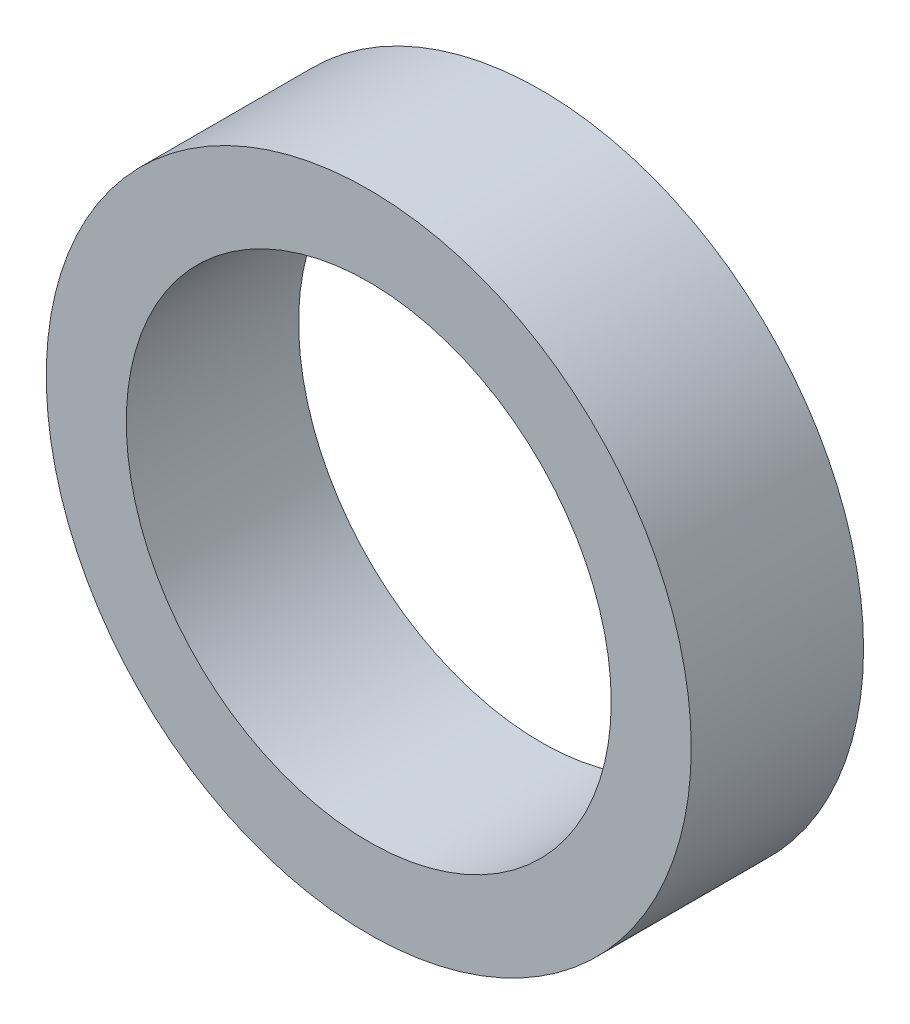
ISO-10303-21;
HEADER;
FILE_DESCRIPTION(('STEP AP214'),'2;1');
FILE_NAME('part.step','',(''),(''),'','','');
FILE_SCHEMA(('AUTOMOTIVE_DESIGN { 1 0 10303 214 1 1 1 1 }'));
ENDSEC;
DATA;
#1=APPLICATION_CONTEXT('core data for automotive mechanical design processes');
#2=APPLICATION_PROTOCOL_DEFINITION('international standard','automotive_design',2000,#1);
#3=PRODUCT_CONTEXT('',#1,'mechanical');
#4=PRODUCT('Part','Part','',(#3));
#5=PRODUCT_RELATED_PRODUCT_CATEGORY('part','',(#4));
#6=PRODUCT_DEFINITION_FORMATION('','',#4);
#7=PRODUCT_DEFINITION_CONTEXT('part definition',#1,'design');
#8=PRODUCT_DEFINITION('design','',#6,#7);
#9=PRODUCT_DEFINITION_SHAPE('','',#8);
#10=(LENGTH_UNIT() NAMED_UNIT(*) SI_UNIT(.MILLI.,.METRE.));
#11=(NAMED_UNIT(*) PLANE_ANGLE_UNIT() SI_UNIT($,.RADIAN.));
#12=(NAMED_UNIT(*) SI_UNIT($,.STERADIAN.) SOLID_ANGLE_UNIT());
#13=UNCERTAINTY_MEASURE_WITH_UNIT(LENGTH_MEASURE(1.E-05),#10,'distance_accuracy_value','');
#14=(GEOMETRIC_REPRESENTATION_CONTEXT(3) GLOBAL_UNCERTAINTY_ASSIGNED_CONTEXT((#13)) GLOBAL_UNIT_ASSIGNED_CONTEXT((#10,
#11,#12)) REPRESENTATION_CONTEXT('',''));
#15=CARTESIAN_POINT('',(0.,0.,0.));
#16=DIRECTION('',(0.,0.,1.));
#17=DIRECTION('',(1.,0.,0.));
#18=AXIS2_PLACEMENT_3D('',#15,#16,#17);
#19=CARTESIAN_POINT('',(0.,0.,35.));
#20=DIRECTION('',(0.,0.,1.));
#21=DIRECTION('',(1.,0.,0.));
#22=AXIS2_PLACEMENT_3D('',#19,#20,#21);
#23=PLANE('',#22);
#24=CARTESIAN_POINT('',(0.,0.,35.));
#25=DIRECTION('',(0.,0.,1.));
#26=DIRECTION('',(1.,0.,0.));
#27=AXIS2_PLACEMENT_3D('',#24,#25,#26);
#28=CIRCLE('',#27,65.5);
#29=CARTESIAN_POINT('',(65.5,0.,35.));
#30=VERTEX_POINT('',#29);
#31=EDGE_CURVE('E10',#30,#30,#28,.T.);
#32=ORIENTED_EDGE('',*,*,#31,.T.);
#33=EDGE_LOOP('',(#32));
#34=FACE_BOUND('',#33,.T.);
#35=CARTESIAN_POINT('',(0.,0.,35.));
#36=DIRECTION('',(0.,0.,1.));
#37=DIRECTION('',(1.,0.,0.));
#38=AXIS2_PLACEMENT_3D('',#35,#36,#37);
#39=CIRCLE('',#38,49.25);
#40=CARTESIAN_POINT('',(49.25,0.,35.));
#41=VERTEX_POINT('',#40);
#42=EDGE_CURVE('E56',#41,#41,#39,.T.);
#43=ORIENTED_EDGE('',*,*,#42,.F.);
#44=EDGE_LOOP('',(#43));
#45=FACE_BOUND('',#44,.T.);
#46=ADVANCED_FACE('F43',(#34,#45),#23,.T.);
#47=CARTESIAN_POINT('',(0.,0.,0.));
#48=DIRECTION('',(0.,0.,1.));
#49=DIRECTION('',(1.,0.,0.));
#50=AXIS2_PLACEMENT_3D('',#47,#48,#49);
#51=PLANE('',#50);
#52=CARTESIAN_POINT('',(0.,0.,0.));
#53=DIRECTION('',(0.,0.,1.));
#54=DIRECTION('',(1.,0.,0.));
#55=AXIS2_PLACEMENT_3D('',#52,#53,#54);
#56=CIRCLE('',#55,65.5);
#57=CARTESIAN_POINT('',(65.5,0.,0.));
#58=VERTEX_POINT('',#57);
#59=EDGE_CURVE('E47',#58,#58,#56,.T.);
#60=ORIENTED_EDGE('',*,*,#59,.F.);
#61=EDGE_LOOP('',(#60));
#62=FACE_BOUND('',#61,.T.);
#63=CARTESIAN_POINT('',(0.,0.,0.));
#64=DIRECTION('',(0.,0.,1.));
#65=DIRECTION('',(1.,0.,0.));
#66=AXIS2_PLACEMENT_3D('',#63,#64,#65);
#67=CIRCLE('',#66,49.25);
#68=CARTESIAN_POINT('',(49.25,0.,0.));
#69=VERTEX_POINT('',#68);
#70=EDGE_CURVE('E58',#69,#69,#67,.T.);
#71=ORIENTED_EDGE('',*,*,#70,.T.);
#72=EDGE_LOOP('',(#71));
#73=FACE_BOUND('',#72,.T.);
#74=ADVANCED_FACE('F70',(#62,#73),#51,.F.);
#75=CARTESIAN_POINT('',(0.,0.,35.));
#76=DIRECTION('',(0.,0.,-1.));
#77=DIRECTION('',(-1.,0.,0.));
#78=AXIS2_PLACEMENT_3D('',#75,#76,#77);
#79=CYLINDRICAL_SURFACE('',#78,65.5);
#80=ORIENTED_EDGE('',*,*,#31,.F.);
#81=EDGE_LOOP('',(#80));
#82=FACE_BOUND('',#81,.T.);
#83=ORIENTED_EDGE('',*,*,#59,.T.);
#84=EDGE_LOOP('',(#83));
#85=FACE_BOUND('',#84,.T.);
#86=ADVANCED_FACE('F45',(#82,#85),#79,.T.);
#87=CARTESIAN_POINT('',(0.,0.,35.));
#88=DIRECTION('',(0.,0.,-1.));
#89=DIRECTION('',(-1.,0.,0.));
#90=AXIS2_PLACEMENT_3D('',#87,#88,#89);
#91=CYLINDRICAL_SURFACE('',#90,49.25);
#92=ORIENTED_EDGE('',*,*,#42,.T.);
#93=EDGE_LOOP('',(#92));
#94=FACE_BOUND('',#93,.T.);
#95=ORIENTED_EDGE('',*,*,#70,.F.);
#96=EDGE_LOOP('',(#95));
#97=FACE_BOUND('',#96,.T.);
#98=ADVANCED_FACE('F66',(#94,#97),#91,.F.);
#99=CLOSED_SHELL('',(#46,#74,#86,#98));
#100=MANIFOLD_SOLID_BREP('B2',#99);
#101=ADVANCED_BREP_SHAPE_REPRESENTATION('',(#18,#100),#14);
#102=SHAPE_DEFINITION_REPRESENTATION(#9,#101);
ENDSEC;
END-ISO-10303-21;
